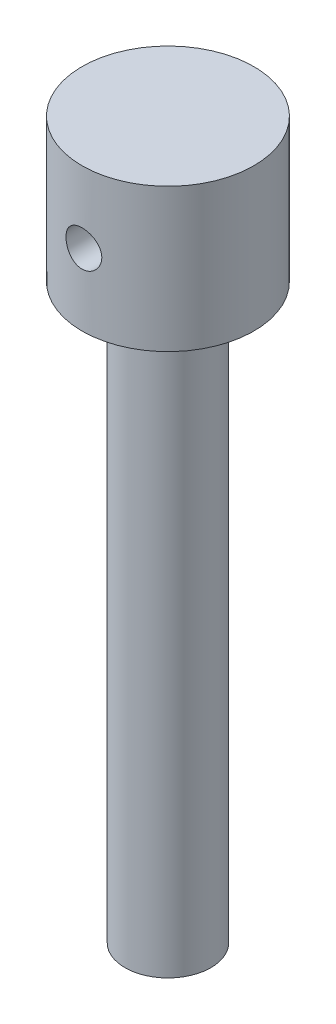
ISO-10303-21;
HEADER;
FILE_DESCRIPTION(('STEP AP214'),'2;1');
FILE_NAME('part.step','',(''),(''),'','','');
FILE_SCHEMA(('AUTOMOTIVE_DESIGN { 1 0 10303 214 1 1 1 1 }'));
ENDSEC;
DATA;
#1=APPLICATION_CONTEXT('core data for automotive mechanical design processes');
#2=APPLICATION_PROTOCOL_DEFINITION('international standard','automotive_design',2000,#1);
#3=PRODUCT_CONTEXT('',#1,'mechanical');
#4=PRODUCT('Part','Part','',(#3));
#5=PRODUCT_RELATED_PRODUCT_CATEGORY('part','',(#4));
#6=PRODUCT_DEFINITION_FORMATION('','',#4);
#7=PRODUCT_DEFINITION_CONTEXT('part definition',#1,'design');
#8=PRODUCT_DEFINITION('design','',#6,#7);
#9=PRODUCT_DEFINITION_SHAPE('','',#8);
#10=(LENGTH_UNIT() NAMED_UNIT(*) SI_UNIT(.MILLI.,.METRE.));
#11=(NAMED_UNIT(*) PLANE_ANGLE_UNIT() SI_UNIT($,.RADIAN.));
#12=(NAMED_UNIT(*) SI_UNIT($,.STERADIAN.) SOLID_ANGLE_UNIT());
#13=UNCERTAINTY_MEASURE_WITH_UNIT(LENGTH_MEASURE(1.E-05),#10,'distance_accuracy_value','');
#14=(GEOMETRIC_REPRESENTATION_CONTEXT(3) GLOBAL_UNCERTAINTY_ASSIGNED_CONTEXT((#13)) GLOBAL_UNIT_ASSIGNED_CONTEXT((#10,
#11,#12)) REPRESENTATION_CONTEXT('',''));
#15=CARTESIAN_POINT('',(0.,0.,0.));
#16=DIRECTION('',(0.,0.,1.));
#17=DIRECTION('',(1.,0.,0.));
#18=AXIS2_PLACEMENT_3D('',#15,#16,#17);
#19=CARTESIAN_POINT('',(0.,20.,0.));
#20=DIRECTION('',(0.,-1.,0.));
#21=DIRECTION('',(0.,0.,-1.));
#22=AXIS2_PLACEMENT_3D('',#19,#20,#21);
#23=CYLINDRICAL_SURFACE('',#22,12.);
#24=CARTESIAN_POINT('',(0.,12.5,-12.));
#25=CARTESIAN_POINT('',(-0.138818083403321,12.4999950450616,-11.999997430533));
#26=CARTESIAN_POINT('',(-0.277697579041751,12.4883986685625,-11.9975665755009));
#27=CARTESIAN_POINT('',(-0.551522632533987,12.4423613009343,-11.9881040198136));
#28=CARTESIAN_POINT('',(-0.686465120256625,12.4079029539261,-11.981068823785));
#29=CARTESIAN_POINT('',(-0.948418264582684,12.3172590901564,-11.963182183924));
#30=CARTESIAN_POINT('',(-1.07543667341837,12.2610952080022,-11.9523345410529));
#31=CARTESIAN_POINT('',(-1.31824065721192,12.1287007822876,-11.9279985561972));
#32=CARTESIAN_POINT('',(-1.43402673506865,12.0524711376883,-11.9145103325195));
#33=CARTESIAN_POINT('',(-1.65278064861767,11.8809273196187,-11.886154000493));
#34=CARTESIAN_POINT('',(-1.75556048832537,11.7853759975298,-11.8712701169706));
#35=CARTESIAN_POINT('',(-1.94375555353879,11.5784106816098,-11.841913153849));
#36=CARTESIAN_POINT('',(-2.02916934192198,11.4669953762555,-11.8274401083337));
#37=CARTESIAN_POINT('',(-2.18102063354434,11.2300960624677,-11.8003888519062));
#38=CARTESIAN_POINT('',(-2.24726109361302,11.1044832309945,-11.7878309034966));
#39=CARTESIAN_POINT('',(-2.35762238696128,10.8436050964545,-11.7662568130004));
#40=CARTESIAN_POINT('',(-2.40174560335283,10.7083408351149,-11.7572402893514));
#41=CARTESIAN_POINT('',(-2.46600480267474,10.4340295251687,-11.7439300197224));
#42=CARTESIAN_POINT('',(-2.48647195393598,10.2950632813305,-11.7395711371173));
#43=CARTESIAN_POINT('',(-2.50386715311229,10.0156063142747,-11.7358738143298));
#44=CARTESIAN_POINT('',(-2.50079781789374,9.87511576226941,-11.7365348160196));
#45=CARTESIAN_POINT('',(-2.47147438074394,9.59903794404965,-11.7427434863835));
#46=CARTESIAN_POINT('',(-2.44560210465441,9.46340804067758,-11.748210673598));
#47=CARTESIAN_POINT('',(-2.37201087059891,9.19845698071015,-11.7632887523188));
#48=CARTESIAN_POINT('',(-2.32429078962764,9.06913614878734,-11.7728998568263));
#49=CARTESIAN_POINT('',(-2.20800006427857,8.81938554316804,-11.795263829282));
#50=CARTESIAN_POINT('',(-2.13928005068474,8.69902740694585,-11.8080390757117));
#51=CARTESIAN_POINT('',(-1.98304539854964,8.47140851146368,-11.8352778002144));
#52=CARTESIAN_POINT('',(-1.89552842452518,8.36414938232805,-11.8497414879707));
#53=CARTESIAN_POINT('',(-1.70214984309357,8.16357207783926,-11.8790746185982));
#54=CARTESIAN_POINT('',(-1.59596286682417,8.07056766220597,-11.8939464639895));
#55=CARTESIAN_POINT('',(-1.3693345772236,7.90363911554205,-11.92216176286));
#56=CARTESIAN_POINT('',(-1.24889305005153,7.82971527080321,-11.9355051934047));
#57=CARTESIAN_POINT('',(-0.996811082470958,7.70297983692809,-11.9591974188563));
#58=CARTESIAN_POINT('',(-0.865150923853001,7.65020639086576,-11.9695407942052));
#59=CARTESIAN_POINT('',(-0.594569241944311,7.56761659032901,-11.9860267642256));
#60=CARTESIAN_POINT('',(-0.45564867719018,7.5377972135372,-11.9921699119211));
#61=CARTESIAN_POINT('',(-0.177183731401671,7.50241149586423,-11.9994855043091));
#62=CARTESIAN_POINT('',(-0.0376961110523577,7.4964161170115,-12.0007458707516));
#63=CARTESIAN_POINT('',(0.240287597515429,7.5076898999382,-11.9983990450555));
#64=CARTESIAN_POINT('',(0.378783745924515,7.52495763720319,-11.9947921509631));
#65=CARTESIAN_POINT('',(0.649452734239626,7.58191130693906,-11.9831712995837));
#66=CARTESIAN_POINT('',(0.781674385788412,7.62137497076693,-11.9752010573615));
#67=CARTESIAN_POINT('',(1.03762289332266,7.72135572084281,-11.9557445448479));
#68=CARTESIAN_POINT('',(1.16134907267355,7.78187448173196,-11.9442579948916));
#69=CARTESIAN_POINT('',(1.39858861388699,7.92316075647512,-11.9188248298143));
#70=CARTESIAN_POINT('',(1.51194643893967,8.00418385913812,-11.9048478762466));
#71=CARTESIAN_POINT('',(1.72361089177304,8.18383912615254,-11.8760513659942));
#72=CARTESIAN_POINT('',(1.82191575582657,8.28247335103788,-11.8612317108502));
#73=CARTESIAN_POINT('',(2.0023572973036,8.4965111539994,-11.8321204906275));
#74=CARTESIAN_POINT('',(2.08419829200409,8.61216606391056,-11.81784178615));
#75=CARTESIAN_POINT('',(2.22729438158487,8.85583256842757,-11.7917120203161));
#76=CARTESIAN_POINT('',(2.28855033355728,8.98384364827821,-11.779860857893));
#77=CARTESIAN_POINT('',(2.38834492887844,9.24792239259646,-11.7600340141608));
#78=CARTESIAN_POINT('',(2.42700619656063,9.38394207433167,-11.7520374556937));
#79=CARTESIAN_POINT('',(2.48088077046815,9.66073310098452,-11.7407836941939));
#80=CARTESIAN_POINT('',(2.49609743088882,9.80150376323888,-11.7375258132073));
#81=CARTESIAN_POINT('',(2.50251852975223,10.0808268019993,-11.7361581461701));
#82=CARTESIAN_POINT('',(2.49419085245451,10.2193681404441,-11.73794804643));
#83=CARTESIAN_POINT('',(2.45479810628064,10.4930280178404,-11.7462489450985));
#84=CARTESIAN_POINT('',(2.42373325564532,10.6281465896322,-11.7527598981925));
#85=CARTESIAN_POINT('',(2.3399643553717,10.8907955437813,-11.7697226489543));
#86=CARTESIAN_POINT('',(2.28732235136843,11.0183464929739,-11.7801631401586));
#87=CARTESIAN_POINT('',(2.16194914599515,11.2628775520533,-11.8038141147748));
#88=CARTESIAN_POINT('',(2.0892160796606,11.3798566792663,-11.8170248553092));
#89=CARTESIAN_POINT('',(1.92414739068482,11.6022432541589,-11.8450315910229));
#90=CARTESIAN_POINT('',(1.83147578083645,11.70739824913,-11.8598522773681));
#91=CARTESIAN_POINT('',(1.62984887623067,11.9008189864527,-11.8892367916643));
#92=CARTESIAN_POINT('',(1.52088983766594,11.989080835103,-11.9038005596976));
#93=CARTESIAN_POINT('',(1.28826885501541,12.1471771463681,-11.9312288909528));
#94=CARTESIAN_POINT('',(1.1644518430427,12.2167873597726,-11.9440719214649));
#95=CARTESIAN_POINT('',(0.906639687996909,12.33410045686,-11.9663981698818));
#96=CARTESIAN_POINT('',(0.772653563814489,12.3818224943638,-11.975884323642));
#97=CARTESIAN_POINT('',(0.532030585800212,12.4450805565769,-11.9886499956289));
#98=CARTESIAN_POINT('',(0.42673518745586,12.4656375264177,-11.9928807132279));
#99=CARTESIAN_POINT('',(0.214305348353075,12.4930989085547,-11.9985566557952));
#100=CARTESIAN_POINT('',(0.107170975697744,12.5000038253344,-12.0000019836917));
#101=CARTESIAN_POINT('',(0.,12.5,-12.));
#102=B_SPLINE_CURVE_WITH_KNOTS('',3,(#24,#25,#26,#27,#28,#29,#30,#31,#32,#33,#34,#35,#36,#37,
#38,#39,#40,#41,#42,#43,#44,#45,#46,#47,#48,#49,#50,#51,#52,#53,#54,#55,#56,#57,#58,#59,#60,#61,
#62,#63,#64,#65,#66,#67,#68,#69,#70,#71,#72,#73,#74,#75,#76,#77,#78,#79,#80,#81,#82,#83,#84,#85,
#86,#87,#88,#89,#90,#91,#92,#93,#94,#95,#96,#97,#98,#99,#100,#101),.UNSPECIFIED.,.T.,.F.,(4,2,2,
2,2,2,2,2,2,2,2,2,2,2,2,2,2,2,2,2,2,2,2,2,2,2,2,2,2,2,2,2,2,2,2,2,2,2,4),(0.,0.416062090206366,
0.83244039981245,1.24840475765089,1.66435048314598,2.08575052776245,2.50718543103572,
2.93280898357097,3.35838666570981,3.77793150339709,4.19742969534329,4.61003424258119,
5.0226600006056,5.43829184833499,5.85397536736069,6.27779052710932,6.70161204556436,
7.12619448999325,7.55072102091543,7.96756678815352,8.38438703104556,8.79710573265244,
9.20985726781867,9.62803167991474,10.0462550512915,10.4714252765867,10.8965777970262,
11.3194010019005,11.7421637082837,12.1565844658208,12.5710012456272,12.9842346278651,
13.3975063816296,13.8183804966062,14.2393515023474,14.6651772879651,15.0906297292995,
15.4118517695456,15.7330619394678),.UNSPECIFIED.);
#103=CARTESIAN_POINT('',(0.,12.5,-12.));
#104=VERTEX_POINT('',#103);
#105=EDGE_CURVE('E10',#104,#104,#102,.T.);
#106=ORIENTED_EDGE('',*,*,#105,.T.);
#107=EDGE_LOOP('',(#106));
#108=FACE_BOUND('',#107,.T.);
#109=CARTESIAN_POINT('',(2.5,10.,11.7366945943055));
#110=CARTESIAN_POINT('',(2.499995017553,9.86121876969622,11.7366973843002));
#111=CARTESIAN_POINT('',(2.48840458867923,9.7223760559691,11.7391829184982));
#112=CARTESIAN_POINT('',(2.44239298467531,9.44862736536597,11.7488403116286));
#113=CARTESIAN_POINT('',(2.40795430880677,9.31372448898728,11.7560157627658));
#114=CARTESIAN_POINT('',(2.31736795014468,9.05185525433014,11.7742058592406));
#115=CARTESIAN_POINT('',(2.26124282497867,8.92488080801636,11.7852165141394));
#116=CARTESIAN_POINT('',(2.12893977203463,8.68215100070883,11.8098316267143));
#117=CARTESIAN_POINT('',(2.05276265471639,8.56639518653997,11.8234359795523));
#118=CARTESIAN_POINT('',(1.88127279893217,8.34760924969306,11.8519386932295));
#119=CARTESIAN_POINT('',(1.78571110973934,8.24477621274706,11.8668522874608));
#120=CARTESIAN_POINT('',(1.57870244776127,8.05647786270379,11.8961593360515));
#121=CARTESIAN_POINT('',(1.46725431091201,7.97101382341712,11.9105527521983));
#122=CARTESIAN_POINT('',(1.23032410599918,7.81910822383428,11.937362702377));
#123=CARTESIAN_POINT('',(1.10471885640989,7.75285494707348,11.9497591726249));
#124=CARTESIAN_POINT('',(0.843857102013441,7.64246789428044,11.971006946866));
#125=CARTESIAN_POINT('',(0.708601579901184,7.59833186969294,11.9798586112245));
#126=CARTESIAN_POINT('',(0.434325808401007,7.53404847776506,11.9929117978436));
#127=CARTESIAN_POINT('',(0.295386761832717,7.51356796560967,11.9971778391985));
#128=CARTESIAN_POINT('',(0.01598369767905,7.49613660848596,12.0008022516123));
#129=CARTESIAN_POINT('',(-0.124480159473676,7.49918331161379,12.0001611340738));
#130=CARTESIAN_POINT('',(-0.400653172399143,7.52846920191348,11.9940931618102));
#131=CARTESIAN_POINT('',(-0.53640225745295,7.55434943791623,11.9887403791317));
#132=CARTESIAN_POINT('',(-0.801587492579504,7.62799725066261,11.9739344179777));
#133=CARTESIAN_POINT('',(-0.931023375022044,7.67576575440615,11.9644810658381));
#134=CARTESIAN_POINT('',(-1.18092001076937,7.79216010425099,11.9424153464785));
#135=CARTESIAN_POINT('',(-1.3013142699633,7.86092458841931,11.9297820825069));
#136=CARTESIAN_POINT('',(-1.5289869130213,8.01725600568083,11.9027460088038));
#137=CARTESIAN_POINT('',(-1.63626366363284,8.10482527641225,11.8883429791665));
#138=CARTESIAN_POINT('',(-1.83678840655383,8.29824324978211,11.8590340046655));
#139=CARTESIAN_POINT('',(-1.92973297498959,8.40440611996389,11.8441236995185));
#140=CARTESIAN_POINT('',(-2.09655194480976,8.6309640979896,11.8157374529799));
#141=CARTESIAN_POINT('',(-2.1704259213996,8.75135952277447,11.8022615435432));
#142=CARTESIAN_POINT('',(-2.29712434276909,9.00342450965759,11.7782599681831));
#143=CARTESIAN_POINT('',(-2.34989610979454,9.13512130138686,11.7677417046425));
#144=CARTESIAN_POINT('',(-2.43247155077346,9.40578323873877,11.7509521282072));
#145=CARTESIAN_POINT('',(-2.46227849764697,9.54474734561618,11.7446802101436));
#146=CARTESIAN_POINT('',(-2.49761727734035,9.82323941263781,11.7372156647826));
#147=CARTESIAN_POINT('',(-2.50358885835997,9.96270916907406,11.7359310372695));
#148=CARTESIAN_POINT('',(-2.49227386878589,10.2406516230803,11.7383390403741));
#149=CARTESIAN_POINT('',(-2.47498873715726,10.3791243818047,11.7420313630525));
#150=CARTESIAN_POINT('',(-2.41803116650968,10.6496410321162,11.7538907645233));
#151=CARTESIAN_POINT('',(-2.37859682753743,10.7817373343577,11.7620102256599));
#152=CARTESIAN_POINT('',(-2.27871621721839,11.0374479788832,11.7817667700624));
#153=CARTESIAN_POINT('',(-2.21826809112293,11.1610615713008,11.7934041638211));
#154=CARTESIAN_POINT('',(-2.07709196362969,11.3982128824325,11.8190900387438));
#155=CARTESIAN_POINT('',(-1.99609065470793,11.5115844089323,11.8331701329665));
#156=CARTESIAN_POINT('',(-1.81646888113976,11.7232864983101,11.8620696798782));
#157=CARTESIAN_POINT('',(-1.71784644101035,11.8216153724785,11.8768892153306));
#158=CARTESIAN_POINT('',(-1.50380090168668,12.0021254261943,11.9058984863347));
#159=CARTESIAN_POINT('',(-1.38812381522911,12.0840081900528,11.9200734943982));
#160=CARTESIAN_POINT('',(-1.14440020443272,12.227177504176,11.9459341754481));
#161=CARTESIAN_POINT('',(-1.01635422695377,12.2884649644749,11.9576199584164));
#162=CARTESIAN_POINT('',(-0.752284235695842,12.3882773586347,11.9771229654136));
#163=CARTESIAN_POINT('',(-0.616313421940394,12.4269383310887,11.9849632627299));
#164=CARTESIAN_POINT('',(-0.339626801006946,12.4808288080162,11.9959912282046));
#165=CARTESIAN_POINT('',(-0.198911618923387,12.4960613870655,11.9991795068579));
#166=CARTESIAN_POINT('',(0.0804266869406701,12.502535244097,12.0005281611387));
#167=CARTESIAN_POINT('',(0.21903918435582,12.4942237999895,11.9987822750957));
#168=CARTESIAN_POINT('',(0.492845740747126,12.4548387226941,11.99065748189));
#169=CARTESIAN_POINT('',(0.628039850405488,12.4237654271863,11.9842786434588));
#170=CARTESIAN_POINT('',(0.89086393098402,12.339944410703,11.9676092015489));
#171=CARTESIAN_POINT('',(1.01851310000873,12.2872546722943,11.9573290681437));
#172=CARTESIAN_POINT('',(1.2632211344418,12.1617552045354,11.9339599069615));
#173=CARTESIAN_POINT('',(1.38027907656019,12.0889437233117,11.9208706346327));
#174=CARTESIAN_POINT('',(1.60268064259534,11.9237806640155,11.8930319356995));
#175=CARTESIAN_POINT('',(1.70778526722739,11.8311114238945,11.8782576059507));
#176=CARTESIAN_POINT('',(1.90110548396524,11.6295109979979,11.8488557363333));
#177=CARTESIAN_POINT('',(1.98931704315914,11.5205759400736,11.8342282323044));
#178=CARTESIAN_POINT('',(2.14734903704121,11.287981795159,11.8065838324643));
#179=CARTESIAN_POINT('',(2.21693856248135,11.1641631771794,11.7935881325424));
#180=CARTESIAN_POINT('',(2.3342125584477,10.9063496879379,11.7709407916825));
#181=CARTESIAN_POINT('',(2.381916325835,10.7723639031215,11.7612862067076));
#182=CARTESIAN_POINT('',(2.44513108264677,10.5317874368468,11.7482800883641));
#183=CARTESIAN_POINT('',(2.46566898011599,10.4265409268095,11.7439632719021));
#184=CARTESIAN_POINT('',(2.4931050871655,10.2142084389624,11.7381695052653));
#185=CARTESIAN_POINT('',(2.50000384585404,10.1071225353812,11.7366924407628));
#186=CARTESIAN_POINT('',(2.5,10.,11.7366945943055));
#187=B_SPLINE_CURVE_WITH_KNOTS('',3,(#109,#110,#111,#112,#113,#114,#115,#116,#117,#118,#119,
#120,#121,#122,#123,#124,#125,#126,#127,#128,#129,#130,#131,#132,#133,#134,#135,#136,#137,#138,
#139,#140,#141,#142,#143,#144,#145,#146,#147,#148,#149,#150,#151,#152,#153,#154,#155,#156,#157,
#158,#159,#160,#161,#162,#163,#164,#165,#166,#167,#168,#169,#170,#171,#172,#173,#174,#175,#176,
#177,#178,#179,#180,#181,#182,#183,#184,#185,#186),.UNSPECIFIED.,.T.,.F.,(4,2,2,2,2,2,2,2,2,2,2,
2,2,2,2,2,2,2,2,2,2,2,2,2,2,2,2,2,2,2,2,2,2,2,2,2,2,2,4),(0.,0.415951308142539,
0.832221584834942,1.24806002960546,1.66388166963158,2.0854266693577,2.50700257327748,
2.93258052533688,3.35811520213866,3.77758097718529,4.19700303792678,4.60994682832922,
5.02290810911741,5.43865743955899,5.8544584820852,6.27811724489827,6.70178544383257,
7.12650474664976,7.55116350775195,7.96795032019585,8.38471134593049,8.79707572463847,
9.20947650928063,9.62767835869303,10.0459271216437,10.4711891750669,10.8964324351808,
11.3190919929707,11.7416960791916,12.1563258784529,12.5709495266596,12.984468211702,
13.3980229105635,13.8187663795715,14.2396101685507,14.6654530271772,15.0909196914727,
15.4119973517483,15.7330620852562),.UNSPECIFIED.);
#188=CARTESIAN_POINT('',(2.5,10.,11.7366945943055));
#189=VERTEX_POINT('',#188);
#190=EDGE_CURVE('E49',#189,#189,#187,.T.);
#191=ORIENTED_EDGE('',*,*,#190,.T.);
#192=EDGE_LOOP('',(#191));
#193=FACE_BOUND('',#192,.T.);
#194=CARTESIAN_POINT('',(0.,20.,0.));
#195=DIRECTION('',(0.,1.,0.));
#196=DIRECTION('',(0.,0.,1.));
#197=AXIS2_PLACEMENT_3D('',#194,#195,#196);
#198=CIRCLE('',#197,12.);
#199=CARTESIAN_POINT('',(0.,20.,12.));
#200=VERTEX_POINT('',#199);
#201=EDGE_CURVE('E59',#200,#200,#198,.T.);
#202=ORIENTED_EDGE('',*,*,#201,.F.);
#203=EDGE_LOOP('',(#202));
#204=FACE_BOUND('',#203,.T.);
#205=CARTESIAN_POINT('',(0.,0.,0.));
#206=DIRECTION('',(0.,1.,0.));
#207=DIRECTION('',(0.,0.,1.));
#208=AXIS2_PLACEMENT_3D('',#205,#206,#207);
#209=CIRCLE('',#208,12.);
#210=CARTESIAN_POINT('',(0.,0.,12.));
#211=VERTEX_POINT('',#210);
#212=EDGE_CURVE('E65',#211,#211,#209,.T.);
#213=ORIENTED_EDGE('',*,*,#212,.T.);
#214=EDGE_LOOP('',(#213));
#215=FACE_BOUND('',#214,.T.);
#216=ADVANCED_FACE('F37',(#108,#193,#204,#215),#23,.T.);
#217=CARTESIAN_POINT('',(0.,20.,0.));
#218=DIRECTION('',(0.,1.,0.));
#219=DIRECTION('',(0.,0.,1.));
#220=AXIS2_PLACEMENT_3D('',#217,#218,#219);
#221=PLANE('',#220);
#222=ORIENTED_EDGE('',*,*,#201,.T.);
#223=EDGE_LOOP('',(#222));
#224=FACE_BOUND('',#223,.T.);
#225=ADVANCED_FACE('F82',(#224),#221,.T.);
#226=CARTESIAN_POINT('',(0.,0.,0.));
#227=DIRECTION('',(0.,1.,0.));
#228=DIRECTION('',(0.,0.,1.));
#229=AXIS2_PLACEMENT_3D('',#226,#227,#228);
#230=PLANE('',#229);
#231=CARTESIAN_POINT('',(0.,0.,0.));
#232=DIRECTION('',(0.,-1.,0.));
#233=DIRECTION('',(0.,0.,-1.));
#234=AXIS2_PLACEMENT_3D('',#231,#232,#233);
#235=CIRCLE('',#234,6.);
#236=CARTESIAN_POINT('',(0.,0.,-6.));
#237=VERTEX_POINT('',#236);
#238=EDGE_CURVE('E54',#237,#237,#235,.T.);
#239=ORIENTED_EDGE('',*,*,#238,.F.);
#240=EDGE_LOOP('',(#239));
#241=FACE_BOUND('',#240,.T.);
#242=ORIENTED_EDGE('',*,*,#212,.F.);
#243=EDGE_LOOP('',(#242));
#244=FACE_BOUND('',#243,.T.);
#245=ADVANCED_FACE('F80',(#241,#244),#230,.F.);
#246=CARTESIAN_POINT('',(0.,-80.,0.));
#247=DIRECTION('',(0.,1.,0.));
#248=DIRECTION('',(0.,0.,1.));
#249=AXIS2_PLACEMENT_3D('',#246,#247,#248);
#250=CYLINDRICAL_SURFACE('',#249,6.);
#251=CARTESIAN_POINT('',(0.,-80.,0.));
#252=DIRECTION('',(0.,-1.,0.));
#253=DIRECTION('',(0.,0.,-1.));
#254=AXIS2_PLACEMENT_3D('',#251,#252,#253);
#255=CIRCLE('',#254,6.);
#256=CARTESIAN_POINT('',(0.,-80.,-6.));
#257=VERTEX_POINT('',#256);
#258=EDGE_CURVE('E101',#257,#257,#255,.T.);
#259=ORIENTED_EDGE('',*,*,#258,.F.);
#260=EDGE_LOOP('',(#259));
#261=FACE_BOUND('',#260,.T.);
#262=ORIENTED_EDGE('',*,*,#238,.T.);
#263=EDGE_LOOP('',(#262));
#264=FACE_BOUND('',#263,.T.);
#265=ADVANCED_FACE('F76',(#261,#264),#250,.T.);
#266=CARTESIAN_POINT('',(0.,-80.,0.));
#267=DIRECTION('',(0.,-1.,0.));
#268=DIRECTION('',(0.,0.,-1.));
#269=AXIS2_PLACEMENT_3D('',#266,#267,#268);
#270=PLANE('',#269);
#271=ORIENTED_EDGE('',*,*,#258,.T.);
#272=EDGE_LOOP('',(#271));
#273=FACE_BOUND('',#272,.T.);
#274=ADVANCED_FACE('F71',(#273),#270,.T.);
#275=CARTESIAN_POINT('',(0.,10.,-12.));
#276=DIRECTION('',(0.,0.,1.));
#277=DIRECTION('',(1.,0.,0.));
#278=AXIS2_PLACEMENT_3D('',#275,#276,#277);
#279=CYLINDRICAL_SURFACE('',#278,2.5);
#280=ORIENTED_EDGE('',*,*,#190,.F.);
#281=EDGE_LOOP('',(#280));
#282=FACE_BOUND('',#281,.T.);
#283=ORIENTED_EDGE('',*,*,#105,.F.);
#284=EDGE_LOOP('',(#283));
#285=FACE_BOUND('',#284,.T.);
#286=ADVANCED_FACE('F67',(#282,#285),#279,.F.);
#287=CLOSED_SHELL('',(#216,#225,#245,#265,#274,#286));
#288=MANIFOLD_SOLID_BREP('B2',#287);
#289=ADVANCED_BREP_SHAPE_REPRESENTATION('',(#18,#288),#14);
#290=SHAPE_DEFINITION_REPRESENTATION(#9,#289);
ENDSEC;
END-ISO-10303-21;
